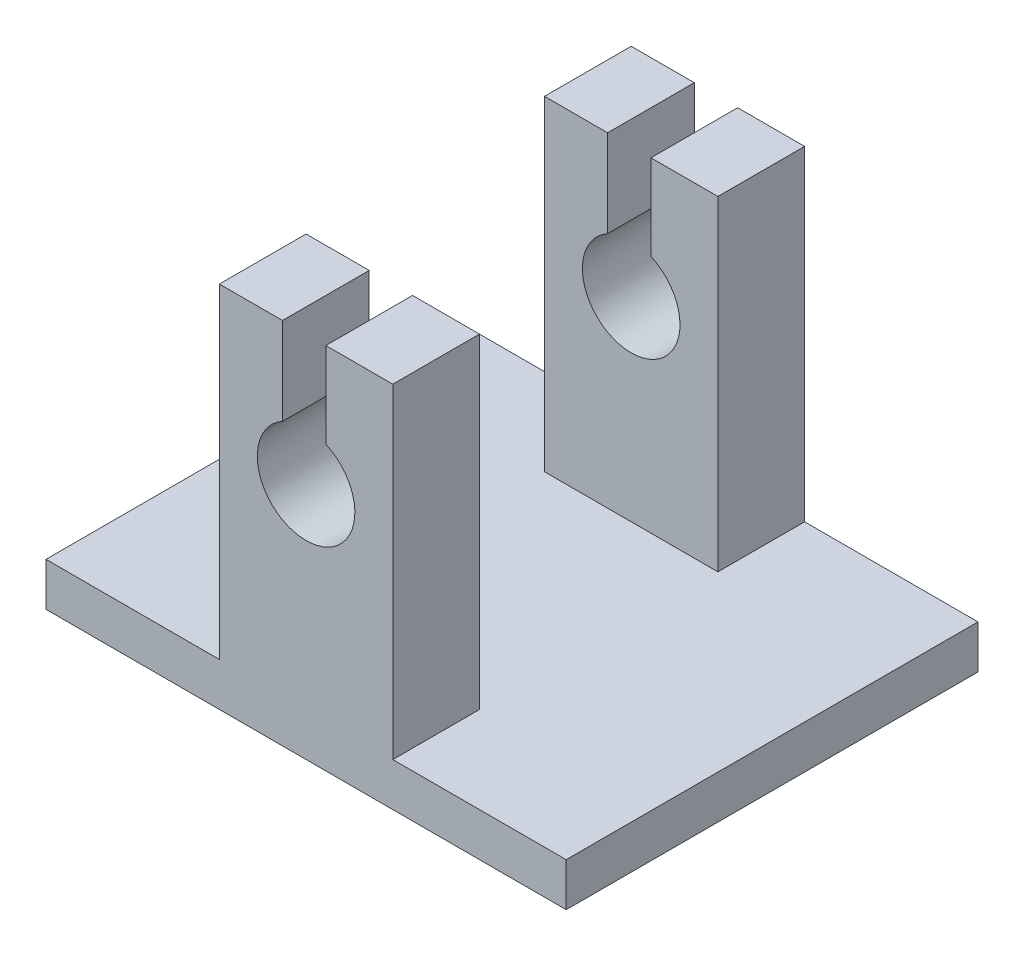
ISO-10303-21;
HEADER;
FILE_DESCRIPTION(('STEP AP214'),'2;1');
FILE_NAME('part.step','',(''),(''),'','','');
FILE_SCHEMA(('AUTOMOTIVE_DESIGN { 1 0 10303 214 1 1 1 1 }'));
ENDSEC;
DATA;
#1=APPLICATION_CONTEXT('core data for automotive mechanical design processes');
#2=APPLICATION_PROTOCOL_DEFINITION('international standard','automotive_design',2000,#1);
#3=PRODUCT_CONTEXT('',#1,'mechanical');
#4=PRODUCT('Part','Part','',(#3));
#5=PRODUCT_RELATED_PRODUCT_CATEGORY('part','',(#4));
#6=PRODUCT_DEFINITION_FORMATION('','',#4);
#7=PRODUCT_DEFINITION_CONTEXT('part definition',#1,'design');
#8=PRODUCT_DEFINITION('design','',#6,#7);
#9=PRODUCT_DEFINITION_SHAPE('','',#8);
#10=(LENGTH_UNIT() NAMED_UNIT(*) SI_UNIT(.MILLI.,.METRE.));
#11=(NAMED_UNIT(*) PLANE_ANGLE_UNIT() SI_UNIT($,.RADIAN.));
#12=(NAMED_UNIT(*) SI_UNIT($,.STERADIAN.) SOLID_ANGLE_UNIT());
#13=UNCERTAINTY_MEASURE_WITH_UNIT(LENGTH_MEASURE(1.E-05),#10,'distance_accuracy_value','');
#14=(GEOMETRIC_REPRESENTATION_CONTEXT(3) GLOBAL_UNCERTAINTY_ASSIGNED_CONTEXT((#13)) GLOBAL_UNIT_ASSIGNED_CONTEXT((#10,
#11,#12)) REPRESENTATION_CONTEXT('',''));
#15=CARTESIAN_POINT('',(0.,0.,0.));
#16=DIRECTION('',(0.,0.,1.));
#17=DIRECTION('',(1.,0.,0.));
#18=AXIS2_PLACEMENT_3D('',#15,#16,#17);
#19=CARTESIAN_POINT('',(0.,107.95,0.));
#20=DIRECTION('',(0.,-1.,0.));
#21=DIRECTION('',(0.,0.,-1.));
#22=AXIS2_PLACEMENT_3D('',#19,#20,#21);
#23=PLANE('',#22);
#24=DIRECTION('',(1.,0.,0.));
#25=VECTOR('',#24,1.);
#26=CARTESIAN_POINT('',(-25.4,107.95,60.325));
#27=LINE('',#26,#25);
#28=CARTESIAN_POINT('',(-25.4,107.95,60.325));
#29=VERTEX_POINT('',#28);
#30=CARTESIAN_POINT('',(-6.91184788312362,107.95,60.325));
#31=VERTEX_POINT('',#30);
#32=EDGE_CURVE('E268',#29,#31,#27,.T.);
#33=ORIENTED_EDGE('',*,*,#32,.T.);
#34=DIRECTION('',(0.,0.,1.));
#35=VECTOR('',#34,1.);
#36=CARTESIAN_POINT('',(-6.91184788312362,107.95,-60.325));
#37=LINE('',#36,#35);
#38=CARTESIAN_POINT('',(-6.91184788312362,107.95,34.925));
#39=VERTEX_POINT('',#38);
#40=EDGE_CURVE('E209',#39,#31,#37,.T.);
#41=ORIENTED_EDGE('',*,*,#40,.F.);
#42=DIRECTION('',(-1.,0.,0.));
#43=VECTOR('',#42,1.);
#44=CARTESIAN_POINT('',(-25.4,107.95,34.925));
#45=LINE('',#44,#43);
#46=CARTESIAN_POINT('',(-25.4,107.95,34.925));
#47=VERTEX_POINT('',#46);
#48=EDGE_CURVE('E260',#39,#47,#45,.T.);
#49=ORIENTED_EDGE('',*,*,#48,.T.);
#50=DIRECTION('',(0.,0.,1.));
#51=VECTOR('',#50,1.);
#52=CARTESIAN_POINT('',(-25.4,107.95,60.325));
#53=LINE('',#52,#51);
#54=EDGE_CURVE('E265',#47,#29,#53,.T.);
#55=ORIENTED_EDGE('',*,*,#54,.T.);
#56=EDGE_LOOP('',(#33,#41,#49,#55));
#57=FACE_BOUND('',#56,.T.);
#58=ADVANCED_FACE('F35',(#57),#23,.F.);
#59=CARTESIAN_POINT('',(0.,107.95,0.));
#60=DIRECTION('',(0.,-1.,0.));
#61=DIRECTION('',(0.,0.,1.));
#62=AXIS2_PLACEMENT_3D('',#59,#60,#61);
#63=PLANE('',#62);
#64=DIRECTION('',(-1.,0.,0.));
#65=VECTOR('',#64,1.);
#66=CARTESIAN_POINT('',(-25.4,107.95,-34.925));
#67=LINE('',#66,#65);
#68=CARTESIAN_POINT('',(-6.91184788312362,107.95,-34.925));
#69=VERTEX_POINT('',#68);
#70=CARTESIAN_POINT('',(-25.4,107.95,-34.925));
#71=VERTEX_POINT('',#70);
#72=EDGE_CURVE('E235',#69,#71,#67,.T.);
#73=ORIENTED_EDGE('',*,*,#72,.F.);
#74=CARTESIAN_POINT('',(-6.91184788312362,107.95,-60.325));
#75=VERTEX_POINT('',#74);
#76=EDGE_CURVE('E207',#75,#69,#37,.T.);
#77=ORIENTED_EDGE('',*,*,#76,.F.);
#78=DIRECTION('',(1.,0.,0.));
#79=VECTOR('',#78,1.);
#80=CARTESIAN_POINT('',(-25.4,107.95,-60.325));
#81=LINE('',#80,#79);
#82=CARTESIAN_POINT('',(-25.4,107.95,-60.325));
#83=VERTEX_POINT('',#82);
#84=EDGE_CURVE('E196',#83,#75,#81,.T.);
#85=ORIENTED_EDGE('',*,*,#84,.F.);
#86=DIRECTION('',(0.,0.,-1.));
#87=VECTOR('',#86,1.);
#88=CARTESIAN_POINT('',(-25.4,107.95,-60.325));
#89=LINE('',#88,#87);
#90=EDGE_CURVE('E232',#71,#83,#89,.T.);
#91=ORIENTED_EDGE('',*,*,#90,.F.);
#92=EDGE_LOOP('',(#73,#77,#85,#91));
#93=FACE_BOUND('',#92,.T.);
#94=ADVANCED_FACE('F367',(#93),#63,.F.);
#95=CARTESIAN_POINT('',(0.,12.7,0.));
#96=DIRECTION('',(0.,-1.,0.));
#97=DIRECTION('',(0.,0.,-1.));
#98=AXIS2_PLACEMENT_3D('',#95,#96,#97);
#99=PLANE('',#98);
#100=DIRECTION('',(-1.,0.,0.));
#101=VECTOR('',#100,1.);
#102=CARTESIAN_POINT('',(-76.2,12.7,-60.325));
#103=LINE('',#102,#101);
#104=CARTESIAN_POINT('',(76.2,12.7,-60.325));
#105=VERTEX_POINT('',#104);
#106=CARTESIAN_POINT('',(25.4,12.7,-60.325));
#107=VERTEX_POINT('',#106);
#108=EDGE_CURVE('E296',#105,#107,#103,.T.);
#109=ORIENTED_EDGE('',*,*,#108,.T.);
#110=DIRECTION('',(0.,0.,1.));
#111=VECTOR('',#110,1.);
#112=CARTESIAN_POINT('',(25.4,12.7,-60.325));
#113=LINE('',#112,#111);
#114=CARTESIAN_POINT('',(25.4,12.7,-34.925));
#115=VERTEX_POINT('',#114);
#116=EDGE_CURVE('E225',#107,#115,#113,.T.);
#117=ORIENTED_EDGE('',*,*,#116,.T.);
#118=DIRECTION('',(-1.,0.,0.));
#119=VECTOR('',#118,1.);
#120=CARTESIAN_POINT('',(-25.4,12.7,-34.925));
#121=LINE('',#120,#119);
#122=CARTESIAN_POINT('',(-25.4,12.7,-34.925));
#123=VERTEX_POINT('',#122);
#124=EDGE_CURVE('E230',#115,#123,#121,.T.);
#125=ORIENTED_EDGE('',*,*,#124,.T.);
#126=DIRECTION('',(0.,0.,-1.));
#127=VECTOR('',#126,1.);
#128=CARTESIAN_POINT('',(-25.4,12.7,-60.325));
#129=LINE('',#128,#127);
#130=CARTESIAN_POINT('',(-25.4,12.7,-60.325));
#131=VERTEX_POINT('',#130);
#132=EDGE_CURVE('E241',#123,#131,#129,.T.);
#133=ORIENTED_EDGE('',*,*,#132,.T.);
#134=CARTESIAN_POINT('',(-76.2,12.7,-60.325));
#135=VERTEX_POINT('',#134);
#136=EDGE_CURVE('E294',#131,#135,#103,.T.);
#137=ORIENTED_EDGE('',*,*,#136,.T.);
#138=DIRECTION('',(0.,0.,1.));
#139=VECTOR('',#138,1.);
#140=CARTESIAN_POINT('',(-76.2,12.7,60.325));
#141=LINE('',#140,#139);
#142=CARTESIAN_POINT('',(-76.2,12.7,60.325));
#143=VERTEX_POINT('',#142);
#144=EDGE_CURVE('E298',#135,#143,#141,.T.);
#145=ORIENTED_EDGE('',*,*,#144,.T.);
#146=DIRECTION('',(1.,0.,0.));
#147=VECTOR('',#146,1.);
#148=CARTESIAN_POINT('',(-76.2,12.7,60.325));
#149=LINE('',#148,#147);
#150=CARTESIAN_POINT('',(-25.4,12.7,60.325));
#151=VERTEX_POINT('',#150);
#152=EDGE_CURVE('E301',#143,#151,#149,.T.);
#153=ORIENTED_EDGE('',*,*,#152,.T.);
#154=DIRECTION('',(0.,0.,1.));
#155=VECTOR('',#154,1.);
#156=CARTESIAN_POINT('',(-25.4,12.7,60.325));
#157=LINE('',#156,#155);
#158=CARTESIAN_POINT('',(-25.4,12.7,34.925));
#159=VERTEX_POINT('',#158);
#160=EDGE_CURVE('E261',#159,#151,#157,.T.);
#161=ORIENTED_EDGE('',*,*,#160,.F.);
#162=DIRECTION('',(-1.,0.,0.));
#163=VECTOR('',#162,1.);
#164=CARTESIAN_POINT('',(-25.4,12.7,34.925));
#165=LINE('',#164,#163);
#166=CARTESIAN_POINT('',(25.4,12.7,34.925));
#167=VERTEX_POINT('',#166);
#168=EDGE_CURVE('E274',#167,#159,#165,.T.);
#169=ORIENTED_EDGE('',*,*,#168,.F.);
#170=DIRECTION('',(0.,0.,-1.));
#171=VECTOR('',#170,1.);
#172=CARTESIAN_POINT('',(25.4,12.7,60.325));
#173=LINE('',#172,#171);
#174=CARTESIAN_POINT('',(25.4,12.7,60.325));
#175=VERTEX_POINT('',#174);
#176=EDGE_CURVE('E256',#175,#167,#173,.T.);
#177=ORIENTED_EDGE('',*,*,#176,.F.);
#178=CARTESIAN_POINT('',(76.2,12.7,60.325));
#179=VERTEX_POINT('',#178);
#180=EDGE_CURVE('E300',#175,#179,#149,.T.);
#181=ORIENTED_EDGE('',*,*,#180,.T.);
#182=DIRECTION('',(0.,0.,-1.));
#183=VECTOR('',#182,1.);
#184=CARTESIAN_POINT('',(76.2,12.7,60.325));
#185=LINE('',#184,#183);
#186=EDGE_CURVE('E291',#179,#105,#185,.T.);
#187=ORIENTED_EDGE('',*,*,#186,.T.);
#188=EDGE_LOOP('',(#109,#117,#125,#133,#137,#145,#153,#161,#169,#177,#181,#187));
#189=FACE_BOUND('',#188,.T.);
#190=ADVANCED_FACE('F340',(#189),#99,.F.);
#191=CARTESIAN_POINT('',(76.2,12.7,60.325));
#192=DIRECTION('',(-1.,0.,0.));
#193=DIRECTION('',(0.,0.,1.));
#194=AXIS2_PLACEMENT_3D('',#191,#192,#193);
#195=PLANE('',#194);
#196=DIRECTION('',(0.,0.,-1.));
#197=VECTOR('',#196,1.);
#198=CARTESIAN_POINT('',(76.2,0.,60.325));
#199=LINE('',#198,#197);
#200=CARTESIAN_POINT('',(76.2,0.,60.325));
#201=VERTEX_POINT('',#200);
#202=CARTESIAN_POINT('',(76.2,0.,-60.325));
#203=VERTEX_POINT('',#202);
#204=EDGE_CURVE('E290',#201,#203,#199,.T.);
#205=ORIENTED_EDGE('',*,*,#204,.T.);
#206=DIRECTION('',(0.,-1.,0.));
#207=VECTOR('',#206,1.);
#208=CARTESIAN_POINT('',(76.2,12.7,-60.325));
#209=LINE('',#208,#207);
#210=EDGE_CURVE('E43',#105,#203,#209,.T.);
#211=ORIENTED_EDGE('',*,*,#210,.F.);
#212=ORIENTED_EDGE('',*,*,#186,.F.);
#213=DIRECTION('',(0.,-1.,0.));
#214=VECTOR('',#213,1.);
#215=CARTESIAN_POINT('',(76.2,12.7,60.325));
#216=LINE('',#215,#214);
#217=EDGE_CURVE('E303',#179,#201,#216,.T.);
#218=ORIENTED_EDGE('',*,*,#217,.T.);
#219=EDGE_LOOP('',(#205,#211,#212,#218));
#220=FACE_BOUND('',#219,.T.);
#221=ADVANCED_FACE('F37',(#220),#195,.F.);
#222=CARTESIAN_POINT('',(-76.2,12.7,-60.325));
#223=DIRECTION('',(0.,0.,1.));
#224=DIRECTION('',(1.,0.,0.));
#225=AXIS2_PLACEMENT_3D('',#222,#223,#224);
#226=PLANE('',#225);
#227=ORIENTED_EDGE('',*,*,#84,.T.);
#228=DIRECTION('',(0.,-1.,0.));
#229=VECTOR('',#228,1.);
#230=CARTESIAN_POINT('',(-6.91184788312362,107.95,-60.325));
#231=LINE('',#230,#229);
#232=CARTESIAN_POINT('',(-6.91184788312361,82.354359843293,-60.325));
#233=VERTEX_POINT('',#232);
#234=EDGE_CURVE('E175',#75,#233,#231,.T.);
#235=ORIENTED_EDGE('',*,*,#234,.T.);
#236=CARTESIAN_POINT('',(0.,69.85,-60.325));
#237=DIRECTION('',(0.,0.,1.));
#238=DIRECTION('',(1.,0.,0.));
#239=AXIS2_PLACEMENT_3D('',#236,#237,#238);
#240=CIRCLE('',#239,14.2875);
#241=CARTESIAN_POINT('',(5.78815211687639,82.9125400026909,-60.325));
#242=VERTEX_POINT('',#241);
#243=EDGE_CURVE('E185',#233,#242,#240,.T.);
#244=ORIENTED_EDGE('',*,*,#243,.T.);
#245=DIRECTION('',(0.,1.,0.));
#246=VECTOR('',#245,1.);
#247=CARTESIAN_POINT('',(5.78815211687638,107.95,-60.325));
#248=LINE('',#247,#246);
#249=CARTESIAN_POINT('',(5.78815211687638,107.95,-60.325));
#250=VERTEX_POINT('',#249);
#251=EDGE_CURVE('E191',#242,#250,#248,.T.);
#252=ORIENTED_EDGE('',*,*,#251,.T.);
#253=CARTESIAN_POINT('',(25.4,107.95,-60.325));
#254=VERTEX_POINT('',#253);
#255=EDGE_CURVE('E229',#250,#254,#81,.T.);
#256=ORIENTED_EDGE('',*,*,#255,.T.);
#257=DIRECTION('',(0.,-1.,0.));
#258=VECTOR('',#257,1.);
#259=CARTESIAN_POINT('',(25.4,107.95,-60.325));
#260=LINE('',#259,#258);
#261=EDGE_CURVE('E253',#254,#107,#260,.T.);
#262=ORIENTED_EDGE('',*,*,#261,.T.);
#263=ORIENTED_EDGE('',*,*,#108,.F.);
#264=ORIENTED_EDGE('',*,*,#210,.T.);
#265=DIRECTION('',(-1.,0.,0.));
#266=VECTOR('',#265,1.);
#267=CARTESIAN_POINT('',(-76.2,0.,-60.325));
#268=LINE('',#267,#266);
#269=CARTESIAN_POINT('',(-76.2,0.,-60.325));
#270=VERTEX_POINT('',#269);
#271=EDGE_CURVE('E306',#203,#270,#268,.T.);
#272=ORIENTED_EDGE('',*,*,#271,.T.);
#273=DIRECTION('',(0.,-1.,0.));
#274=VECTOR('',#273,1.);
#275=CARTESIAN_POINT('',(-76.2,12.7,-60.325));
#276=LINE('',#275,#274);
#277=EDGE_CURVE('E316',#135,#270,#276,.T.);
#278=ORIENTED_EDGE('',*,*,#277,.F.);
#279=ORIENTED_EDGE('',*,*,#136,.F.);
#280=DIRECTION('',(0.,-1.,0.));
#281=VECTOR('',#280,1.);
#282=CARTESIAN_POINT('',(-25.4,107.95,-60.325));
#283=LINE('',#282,#281);
#284=EDGE_CURVE('E250',#83,#131,#283,.T.);
#285=ORIENTED_EDGE('',*,*,#284,.F.);
#286=EDGE_LOOP('',(#227,#235,#244,#252,#256,#262,#263,#264,#272,#278,#279,#285));
#287=FACE_BOUND('',#286,.T.);
#288=ADVANCED_FACE('F194',(#287),#226,.F.);
#289=CARTESIAN_POINT('',(-76.2,12.7,60.325));
#290=DIRECTION('',(1.,0.,0.));
#291=DIRECTION('',(0.,0.,-1.));
#292=AXIS2_PLACEMENT_3D('',#289,#290,#291);
#293=PLANE('',#292);
#294=DIRECTION('',(0.,0.,1.));
#295=VECTOR('',#294,1.);
#296=CARTESIAN_POINT('',(-76.2,0.,60.325));
#297=LINE('',#296,#295);
#298=CARTESIAN_POINT('',(-76.2,0.,60.325));
#299=VERTEX_POINT('',#298);
#300=EDGE_CURVE('E308',#270,#299,#297,.T.);
#301=ORIENTED_EDGE('',*,*,#300,.T.);
#302=DIRECTION('',(0.,-1.,0.));
#303=VECTOR('',#302,1.);
#304=CARTESIAN_POINT('',(-76.2,12.7,60.325));
#305=LINE('',#304,#303);
#306=EDGE_CURVE('E313',#143,#299,#305,.T.);
#307=ORIENTED_EDGE('',*,*,#306,.F.);
#308=ORIENTED_EDGE('',*,*,#144,.F.);
#309=ORIENTED_EDGE('',*,*,#277,.T.);
#310=EDGE_LOOP('',(#301,#307,#308,#309));
#311=FACE_BOUND('',#310,.T.);
#312=ADVANCED_FACE('F331',(#311),#293,.F.);
#313=CARTESIAN_POINT('',(-76.2,12.7,60.325));
#314=DIRECTION('',(0.,0.,-1.));
#315=DIRECTION('',(-1.,0.,0.));
#316=AXIS2_PLACEMENT_3D('',#313,#314,#315);
#317=PLANE('',#316);
#318=CARTESIAN_POINT('',(0.,69.85,60.325));
#319=DIRECTION('',(0.,0.,1.));
#320=DIRECTION('',(1.,0.,0.));
#321=AXIS2_PLACEMENT_3D('',#318,#319,#320);
#322=CIRCLE('',#321,14.2875);
#323=CARTESIAN_POINT('',(-6.91184788312361,82.354359843293,60.325));
#324=VERTEX_POINT('',#323);
#325=CARTESIAN_POINT('',(5.78815211687639,82.9125400026909,60.325));
#326=VERTEX_POINT('',#325);
#327=EDGE_CURVE('E198',#324,#326,#322,.T.);
#328=ORIENTED_EDGE('',*,*,#327,.F.);
#329=DIRECTION('',(0.,-1.,0.));
#330=VECTOR('',#329,1.);
#331=CARTESIAN_POINT('',(-6.91184788312362,107.95,60.325));
#332=LINE('',#331,#330);
#333=EDGE_CURVE('E202',#31,#324,#332,.T.);
#334=ORIENTED_EDGE('',*,*,#333,.F.);
#335=ORIENTED_EDGE('',*,*,#32,.F.);
#336=DIRECTION('',(0.,-1.,0.));
#337=VECTOR('',#336,1.);
#338=CARTESIAN_POINT('',(-25.4,107.95,60.325));
#339=LINE('',#338,#337);
#340=EDGE_CURVE('E281',#29,#151,#339,.T.);
#341=ORIENTED_EDGE('',*,*,#340,.T.);
#342=ORIENTED_EDGE('',*,*,#152,.F.);
#343=ORIENTED_EDGE('',*,*,#306,.T.);
#344=DIRECTION('',(1.,0.,0.));
#345=VECTOR('',#344,1.);
#346=CARTESIAN_POINT('',(-76.2,0.,60.325));
#347=LINE('',#346,#345);
#348=EDGE_CURVE('E295',#299,#201,#347,.T.);
#349=ORIENTED_EDGE('',*,*,#348,.T.);
#350=ORIENTED_EDGE('',*,*,#217,.F.);
#351=ORIENTED_EDGE('',*,*,#180,.F.);
#352=DIRECTION('',(0.,-1.,0.));
#353=VECTOR('',#352,1.);
#354=CARTESIAN_POINT('',(25.4,107.95,60.325));
#355=LINE('',#354,#353);
#356=CARTESIAN_POINT('',(25.4,107.95,60.325));
#357=VERTEX_POINT('',#356);
#358=EDGE_CURVE('E271',#357,#175,#355,.T.);
#359=ORIENTED_EDGE('',*,*,#358,.F.);
#360=CARTESIAN_POINT('',(5.78815211687638,107.95,60.325));
#361=VERTEX_POINT('',#360);
#362=EDGE_CURVE('E267',#361,#357,#27,.T.);
#363=ORIENTED_EDGE('',*,*,#362,.F.);
#364=DIRECTION('',(0.,1.,0.));
#365=VECTOR('',#364,1.);
#366=CARTESIAN_POINT('',(5.78815211687638,107.95,60.325));
#367=LINE('',#366,#365);
#368=EDGE_CURVE('E50',#326,#361,#367,.T.);
#369=ORIENTED_EDGE('',*,*,#368,.F.);
#370=EDGE_LOOP('',(#328,#334,#335,#341,#342,#343,#349,#350,#351,#359,#363,#369));
#371=FACE_BOUND('',#370,.T.);
#372=ADVANCED_FACE('F336',(#371),#317,.F.);
#373=CARTESIAN_POINT('',(0.,0.,0.));
#374=DIRECTION('',(0.,-1.,0.));
#375=DIRECTION('',(0.,0.,-1.));
#376=AXIS2_PLACEMENT_3D('',#373,#374,#375);
#377=PLANE('',#376);
#378=ORIENTED_EDGE('',*,*,#204,.F.);
#379=ORIENTED_EDGE('',*,*,#348,.F.);
#380=ORIENTED_EDGE('',*,*,#300,.F.);
#381=ORIENTED_EDGE('',*,*,#271,.F.);
#382=EDGE_LOOP('',(#378,#379,#380,#381));
#383=FACE_BOUND('',#382,.T.);
#384=ADVANCED_FACE('F327',(#383),#377,.T.);
#385=CARTESIAN_POINT('',(25.4,107.95,60.325));
#386=DIRECTION('',(-1.,0.,0.));
#387=DIRECTION('',(0.,0.,1.));
#388=AXIS2_PLACEMENT_3D('',#385,#386,#387);
#389=PLANE('',#388);
#390=ORIENTED_EDGE('',*,*,#176,.T.);
#391=DIRECTION('',(0.,-1.,0.));
#392=VECTOR('',#391,1.);
#393=CARTESIAN_POINT('',(25.4,107.95,34.925));
#394=LINE('',#393,#392);
#395=CARTESIAN_POINT('',(25.4,107.95,34.925));
#396=VERTEX_POINT('',#395);
#397=EDGE_CURVE('E287',#396,#167,#394,.T.);
#398=ORIENTED_EDGE('',*,*,#397,.F.);
#399=DIRECTION('',(0.,0.,-1.));
#400=VECTOR('',#399,1.);
#401=CARTESIAN_POINT('',(25.4,107.95,60.325));
#402=LINE('',#401,#400);
#403=EDGE_CURVE('E257',#357,#396,#402,.T.);
#404=ORIENTED_EDGE('',*,*,#403,.F.);
#405=ORIENTED_EDGE('',*,*,#358,.T.);
#406=EDGE_LOOP('',(#390,#398,#404,#405));
#407=FACE_BOUND('',#406,.T.);
#408=ADVANCED_FACE('F354',(#407),#389,.F.);
#409=CARTESIAN_POINT('',(-25.4,107.95,34.925));
#410=DIRECTION('',(0.,0.,1.));
#411=DIRECTION('',(1.,0.,0.));
#412=AXIS2_PLACEMENT_3D('',#409,#410,#411);
#413=PLANE('',#412);
#414=ORIENTED_EDGE('',*,*,#48,.F.);
#415=DIRECTION('',(0.,-1.,0.));
#416=VECTOR('',#415,1.);
#417=CARTESIAN_POINT('',(-6.91184788312362,107.95,34.925));
#418=LINE('',#417,#416);
#419=CARTESIAN_POINT('',(-6.91184788312361,82.354359843293,34.925));
#420=VERTEX_POINT('',#419);
#421=EDGE_CURVE('E219',#39,#420,#418,.T.);
#422=ORIENTED_EDGE('',*,*,#421,.T.);
#423=CARTESIAN_POINT('',(0.,69.85,34.925));
#424=DIRECTION('',(0.,0.,1.));
#425=DIRECTION('',(1.,0.,0.));
#426=AXIS2_PLACEMENT_3D('',#423,#424,#425);
#427=CIRCLE('',#426,14.2875);
#428=CARTESIAN_POINT('',(5.78815211687639,82.9125400026909,34.925));
#429=VERTEX_POINT('',#428);
#430=EDGE_CURVE('E222',#420,#429,#427,.T.);
#431=ORIENTED_EDGE('',*,*,#430,.T.);
#432=DIRECTION('',(0.,1.,0.));
#433=VECTOR('',#432,1.);
#434=CARTESIAN_POINT('',(5.78815211687637,107.95,34.925));
#435=LINE('',#434,#433);
#436=CARTESIAN_POINT('',(5.78815211687638,107.95,34.925));
#437=VERTEX_POINT('',#436);
#438=EDGE_CURVE('E215',#429,#437,#435,.T.);
#439=ORIENTED_EDGE('',*,*,#438,.T.);
#440=EDGE_CURVE('E262',#396,#437,#45,.T.);
#441=ORIENTED_EDGE('',*,*,#440,.F.);
#442=ORIENTED_EDGE('',*,*,#397,.T.);
#443=ORIENTED_EDGE('',*,*,#168,.T.);
#444=DIRECTION('',(0.,-1.,0.));
#445=VECTOR('',#444,1.);
#446=CARTESIAN_POINT('',(-25.4,107.95,34.925));
#447=LINE('',#446,#445);
#448=EDGE_CURVE('E284',#47,#159,#447,.T.);
#449=ORIENTED_EDGE('',*,*,#448,.F.);
#450=EDGE_LOOP('',(#414,#422,#431,#439,#441,#442,#443,#449));
#451=FACE_BOUND('',#450,.T.);
#452=ADVANCED_FACE('F347',(#451),#413,.F.);
#453=CARTESIAN_POINT('',(-25.4,107.95,60.325));
#454=DIRECTION('',(1.,0.,0.));
#455=DIRECTION('',(0.,0.,-1.));
#456=AXIS2_PLACEMENT_3D('',#453,#454,#455);
#457=PLANE('',#456);
#458=ORIENTED_EDGE('',*,*,#160,.T.);
#459=ORIENTED_EDGE('',*,*,#340,.F.);
#460=ORIENTED_EDGE('',*,*,#54,.F.);
#461=ORIENTED_EDGE('',*,*,#448,.T.);
#462=EDGE_LOOP('',(#458,#459,#460,#461));
#463=FACE_BOUND('',#462,.T.);
#464=ADVANCED_FACE('F342',(#463),#457,.F.);
#465=ORIENTED_EDGE('',*,*,#440,.T.);
#466=DIRECTION('',(0.,0.,1.));
#467=VECTOR('',#466,1.);
#468=CARTESIAN_POINT('',(5.78815211687638,107.95,-60.325));
#469=LINE('',#468,#467);
#470=EDGE_CURVE('E212',#437,#361,#469,.T.);
#471=ORIENTED_EDGE('',*,*,#470,.T.);
#472=ORIENTED_EDGE('',*,*,#362,.T.);
#473=ORIENTED_EDGE('',*,*,#403,.T.);
#474=EDGE_LOOP('',(#465,#471,#472,#473));
#475=FACE_BOUND('',#474,.T.);
#476=ADVANCED_FACE('F356',(#475),#23,.F.);
#477=CARTESIAN_POINT('',(25.4,107.95,-60.325));
#478=DIRECTION('',(1.,0.,0.));
#479=DIRECTION('',(0.,0.,-1.));
#480=AXIS2_PLACEMENT_3D('',#477,#478,#479);
#481=PLANE('',#480);
#482=ORIENTED_EDGE('',*,*,#116,.F.);
#483=ORIENTED_EDGE('',*,*,#261,.F.);
#484=DIRECTION('',(0.,0.,1.));
#485=VECTOR('',#484,1.);
#486=CARTESIAN_POINT('',(25.4,107.95,-60.325));
#487=LINE('',#486,#485);
#488=CARTESIAN_POINT('',(25.4,107.95,-34.925));
#489=VERTEX_POINT('',#488);
#490=EDGE_CURVE('E226',#254,#489,#487,.T.);
#491=ORIENTED_EDGE('',*,*,#490,.T.);
#492=DIRECTION('',(0.,-1.,0.));
#493=VECTOR('',#492,1.);
#494=CARTESIAN_POINT('',(25.4,107.95,-34.925));
#495=LINE('',#494,#493);
#496=EDGE_CURVE('E239',#489,#115,#495,.T.);
#497=ORIENTED_EDGE('',*,*,#496,.T.);
#498=EDGE_LOOP('',(#482,#483,#491,#497));
#499=FACE_BOUND('',#498,.T.);
#500=ADVANCED_FACE('F378',(#499),#481,.T.);
#501=CARTESIAN_POINT('',(-25.4,107.95,-60.325));
#502=DIRECTION('',(-1.,0.,0.));
#503=DIRECTION('',(0.,0.,1.));
#504=AXIS2_PLACEMENT_3D('',#501,#502,#503);
#505=PLANE('',#504);
#506=ORIENTED_EDGE('',*,*,#132,.F.);
#507=DIRECTION('',(0.,-1.,0.));
#508=VECTOR('',#507,1.);
#509=CARTESIAN_POINT('',(-25.4,107.95,-34.925));
#510=LINE('',#509,#508);
#511=EDGE_CURVE('E247',#71,#123,#510,.T.);
#512=ORIENTED_EDGE('',*,*,#511,.F.);
#513=ORIENTED_EDGE('',*,*,#90,.T.);
#514=ORIENTED_EDGE('',*,*,#284,.T.);
#515=EDGE_LOOP('',(#506,#512,#513,#514));
#516=FACE_BOUND('',#515,.T.);
#517=ADVANCED_FACE('F383',(#516),#505,.T.);
#518=CARTESIAN_POINT('',(-25.4,107.95,-34.925));
#519=DIRECTION('',(0.,0.,1.));
#520=DIRECTION('',(1.,0.,0.));
#521=AXIS2_PLACEMENT_3D('',#518,#519,#520);
#522=PLANE('',#521);
#523=DIRECTION('',(0.,-1.,0.));
#524=VECTOR('',#523,1.);
#525=CARTESIAN_POINT('',(-6.91184788312362,107.95,-34.925));
#526=LINE('',#525,#524);
#527=CARTESIAN_POINT('',(-6.91184788312361,82.354359843293,-34.925));
#528=VERTEX_POINT('',#527);
#529=EDGE_CURVE('E178',#69,#528,#526,.T.);
#530=ORIENTED_EDGE('',*,*,#529,.F.);
#531=ORIENTED_EDGE('',*,*,#72,.T.);
#532=ORIENTED_EDGE('',*,*,#511,.T.);
#533=ORIENTED_EDGE('',*,*,#124,.F.);
#534=ORIENTED_EDGE('',*,*,#496,.F.);
#535=CARTESIAN_POINT('',(5.78815211687637,107.95,-34.925));
#536=VERTEX_POINT('',#535);
#537=EDGE_CURVE('E236',#489,#536,#67,.T.);
#538=ORIENTED_EDGE('',*,*,#537,.T.);
#539=DIRECTION('',(0.,1.,0.));
#540=VECTOR('',#539,1.);
#541=CARTESIAN_POINT('',(5.78815211687637,107.95,-34.925));
#542=LINE('',#541,#540);
#543=CARTESIAN_POINT('',(5.78815211687639,82.9125400026909,-34.925));
#544=VERTEX_POINT('',#543);
#545=EDGE_CURVE('E58',#544,#536,#542,.T.);
#546=ORIENTED_EDGE('',*,*,#545,.F.);
#547=CARTESIAN_POINT('',(0.,69.85,-34.925));
#548=DIRECTION('',(0.,0.,1.));
#549=DIRECTION('',(1.,0.,0.));
#550=AXIS2_PLACEMENT_3D('',#547,#548,#549);
#551=CIRCLE('',#550,14.2875);
#552=EDGE_CURVE('E11',#528,#544,#551,.T.);
#553=ORIENTED_EDGE('',*,*,#552,.F.);
#554=EDGE_LOOP('',(#530,#531,#532,#533,#534,#538,#546,#553));
#555=FACE_BOUND('',#554,.T.);
#556=ADVANCED_FACE('F449',(#555),#522,.T.);
#557=ORIENTED_EDGE('',*,*,#255,.F.);
#558=EDGE_CURVE('E210',#250,#536,#469,.T.);
#559=ORIENTED_EDGE('',*,*,#558,.T.);
#560=ORIENTED_EDGE('',*,*,#537,.F.);
#561=ORIENTED_EDGE('',*,*,#490,.F.);
#562=EDGE_LOOP('',(#557,#559,#560,#561));
#563=FACE_BOUND('',#562,.T.);
#564=ADVANCED_FACE('F374',(#563),#63,.F.);
#565=CARTESIAN_POINT('',(5.78815211687638,107.95,-60.325));
#566=DIRECTION('',(1.,0.,0.));
#567=DIRECTION('',(0.,1.,0.));
#568=AXIS2_PLACEMENT_3D('',#565,#566,#567);
#569=PLANE('',#568);
#570=ORIENTED_EDGE('',*,*,#545,.T.);
#571=ORIENTED_EDGE('',*,*,#558,.F.);
#572=ORIENTED_EDGE('',*,*,#251,.F.);
#573=DIRECTION('',(0.,0.,1.));
#574=VECTOR('',#573,1.);
#575=CARTESIAN_POINT('',(5.78815211687639,82.9125400026909,-60.325));
#576=LINE('',#575,#574);
#577=EDGE_CURVE('E187',#242,#544,#576,.T.);
#578=ORIENTED_EDGE('',*,*,#577,.T.);
#579=EDGE_LOOP('',(#570,#571,#572,#578));
#580=FACE_BOUND('',#579,.T.);
#581=ADVANCED_FACE('F464',(#580),#569,.F.);
#582=CARTESIAN_POINT('',(-6.91184788312362,107.95,-60.325));
#583=DIRECTION('',(-1.,0.,0.));
#584=DIRECTION('',(0.,-1.,0.));
#585=AXIS2_PLACEMENT_3D('',#582,#583,#584);
#586=PLANE('',#585);
#587=ORIENTED_EDGE('',*,*,#529,.T.);
#588=DIRECTION('',(0.,0.,1.));
#589=VECTOR('',#588,1.);
#590=CARTESIAN_POINT('',(-6.91184788312361,82.354359843293,-60.325));
#591=LINE('',#590,#589);
#592=EDGE_CURVE('E171',#233,#528,#591,.T.);
#593=ORIENTED_EDGE('',*,*,#592,.F.);
#594=ORIENTED_EDGE('',*,*,#234,.F.);
#595=ORIENTED_EDGE('',*,*,#76,.T.);
#596=EDGE_LOOP('',(#587,#593,#594,#595));
#597=FACE_BOUND('',#596,.T.);
#598=ADVANCED_FACE('F173',(#597),#586,.F.);
#599=CARTESIAN_POINT('',(0.,69.85,-60.325));
#600=DIRECTION('',(0.,0.,1.));
#601=DIRECTION('',(1.,0.,0.));
#602=AXIS2_PLACEMENT_3D('',#599,#600,#601);
#603=CYLINDRICAL_SURFACE('',#602,14.2875);
#604=ORIENTED_EDGE('',*,*,#552,.T.);
#605=ORIENTED_EDGE('',*,*,#577,.F.);
#606=ORIENTED_EDGE('',*,*,#243,.F.);
#607=ORIENTED_EDGE('',*,*,#592,.T.);
#608=EDGE_LOOP('',(#604,#605,#606,#607));
#609=FACE_BOUND('',#608,.T.);
#610=ADVANCED_FACE('F186',(#609),#603,.F.);
#611=EDGE_CURVE('E182',#420,#324,#591,.T.);
#612=ORIENTED_EDGE('',*,*,#611,.T.);
#613=ORIENTED_EDGE('',*,*,#327,.T.);
#614=EDGE_CURVE('E181',#429,#326,#576,.T.);
#615=ORIENTED_EDGE('',*,*,#614,.F.);
#616=ORIENTED_EDGE('',*,*,#430,.F.);
#617=EDGE_LOOP('',(#612,#613,#615,#616));
#618=FACE_BOUND('',#617,.T.);
#619=ADVANCED_FACE('F360',(#618),#603,.F.);
#620=ORIENTED_EDGE('',*,*,#40,.T.);
#621=ORIENTED_EDGE('',*,*,#333,.T.);
#622=ORIENTED_EDGE('',*,*,#611,.F.);
#623=ORIENTED_EDGE('',*,*,#421,.F.);
#624=EDGE_LOOP('',(#620,#621,#622,#623));
#625=FACE_BOUND('',#624,.T.);
#626=ADVANCED_FACE('F363',(#625),#586,.F.);
#627=ORIENTED_EDGE('',*,*,#614,.T.);
#628=ORIENTED_EDGE('',*,*,#368,.T.);
#629=ORIENTED_EDGE('',*,*,#470,.F.);
#630=ORIENTED_EDGE('',*,*,#438,.F.);
#631=EDGE_LOOP('',(#627,#628,#629,#630));
#632=FACE_BOUND('',#631,.T.);
#633=ADVANCED_FACE('F474',(#632),#569,.F.);
#634=CLOSED_SHELL('',(#58,#94,#190,#221,#288,#312,#372,#384,#408,#452,#464,#476,#500,#517,#556,
#564,#581,#598,#610,#619,#626,#633));
#635=MANIFOLD_SOLID_BREP('B2',#634);
#636=ADVANCED_BREP_SHAPE_REPRESENTATION('',(#18,#635),#14);
#637=SHAPE_DEFINITION_REPRESENTATION(#9,#636);
ENDSEC;
END-ISO-10303-21;
